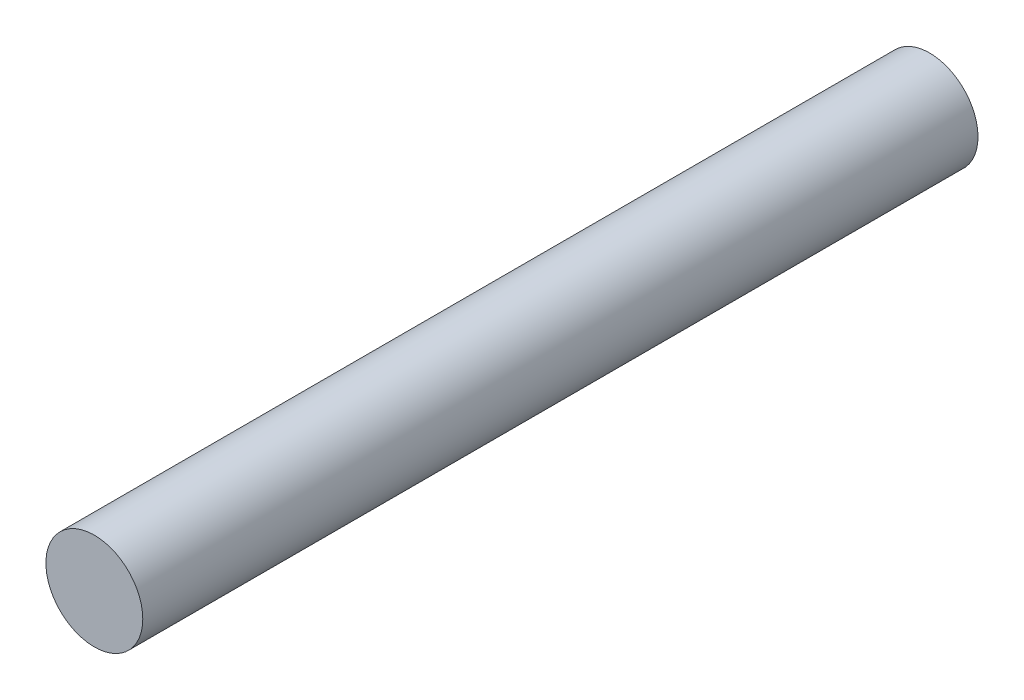
ISO-10303-21;
HEADER;
FILE_DESCRIPTION(('STEP AP214'),'2;1');
FILE_NAME('part.step','',(''),(''),'','','');
FILE_SCHEMA(('AUTOMOTIVE_DESIGN { 1 0 10303 214 1 1 1 1 }'));
ENDSEC;
DATA;
#1=APPLICATION_CONTEXT('core data for automotive mechanical design processes');
#2=APPLICATION_PROTOCOL_DEFINITION('international standard','automotive_design',2000,#1);
#3=PRODUCT_CONTEXT('',#1,'mechanical');
#4=PRODUCT('Part','Part','',(#3));
#5=PRODUCT_RELATED_PRODUCT_CATEGORY('part','',(#4));
#6=PRODUCT_DEFINITION_FORMATION('','',#4);
#7=PRODUCT_DEFINITION_CONTEXT('part definition',#1,'design');
#8=PRODUCT_DEFINITION('design','',#6,#7);
#9=PRODUCT_DEFINITION_SHAPE('','',#8);
#10=(LENGTH_UNIT() NAMED_UNIT(*) SI_UNIT(.MILLI.,.METRE.));
#11=(NAMED_UNIT(*) PLANE_ANGLE_UNIT() SI_UNIT($,.RADIAN.));
#12=(NAMED_UNIT(*) SI_UNIT($,.STERADIAN.) SOLID_ANGLE_UNIT());
#13=UNCERTAINTY_MEASURE_WITH_UNIT(LENGTH_MEASURE(1.E-05),#10,'distance_accuracy_value','');
#14=(GEOMETRIC_REPRESENTATION_CONTEXT(3) GLOBAL_UNCERTAINTY_ASSIGNED_CONTEXT((#13)) GLOBAL_UNIT_ASSIGNED_CONTEXT((#10,
#11,#12)) REPRESENTATION_CONTEXT('',''));
#15=CARTESIAN_POINT('',(0.,0.,0.));
#16=DIRECTION('',(0.,0.,1.));
#17=DIRECTION('',(1.,0.,0.));
#18=AXIS2_PLACEMENT_3D('',#15,#16,#17);
#19=CARTESIAN_POINT('',(-19.7286285002747,-1.85952857214033,185.));
#20=DIRECTION('',(0.,0.,-1.));
#21=DIRECTION('',(-1.,0.,0.));
#22=AXIS2_PLACEMENT_3D('',#19,#20,#21);
#23=CYLINDRICAL_SURFACE('',#22,10.7293812988966);
#24=CARTESIAN_POINT('',(-19.7286285002747,-1.85952857214033,185.));
#25=DIRECTION('',(0.,0.,1.));
#26=DIRECTION('',(1.,0.,0.));
#27=AXIS2_PLACEMENT_3D('',#24,#25,#26);
#28=CIRCLE('',#27,10.7293812988966);
#29=CARTESIAN_POINT('',(-8.99924720137805,-1.85952857214033,185.));
#30=VERTEX_POINT('',#29);
#31=EDGE_CURVE('E10',#30,#30,#28,.T.);
#32=ORIENTED_EDGE('',*,*,#31,.F.);
#33=EDGE_LOOP('',(#32));
#34=FACE_BOUND('',#33,.T.);
#35=CARTESIAN_POINT('',(-19.7286285002747,-1.85952857214033,0.));
#36=DIRECTION('',(0.,0.,1.));
#37=DIRECTION('',(1.,0.,0.));
#38=AXIS2_PLACEMENT_3D('',#35,#36,#37);
#39=CIRCLE('',#38,10.7293812988966);
#40=CARTESIAN_POINT('',(-8.99924720137805,-1.85952857214033,0.));
#41=VERTEX_POINT('',#40);
#42=EDGE_CURVE('E36',#41,#41,#39,.T.);
#43=ORIENTED_EDGE('',*,*,#42,.T.);
#44=EDGE_LOOP('',(#43));
#45=FACE_BOUND('',#44,.T.);
#46=ADVANCED_FACE('F33',(#34,#45),#23,.T.);
#47=CARTESIAN_POINT('',(-19.7286285002747,-1.85952857214033,185.));
#48=DIRECTION('',(0.,0.,1.));
#49=DIRECTION('',(1.,0.,0.));
#50=AXIS2_PLACEMENT_3D('',#47,#48,#49);
#51=PLANE('',#50);
#52=ORIENTED_EDGE('',*,*,#31,.T.);
#53=EDGE_LOOP('',(#52));
#54=FACE_BOUND('',#53,.T.);
#55=ADVANCED_FACE('F48',(#54),#51,.T.);
#56=CARTESIAN_POINT('',(-19.7286285002747,-1.85952857214033,0.));
#57=DIRECTION('',(0.,0.,1.));
#58=DIRECTION('',(1.,0.,0.));
#59=AXIS2_PLACEMENT_3D('',#56,#57,#58);
#60=PLANE('',#59);
#61=ORIENTED_EDGE('',*,*,#42,.F.);
#62=EDGE_LOOP('',(#61));
#63=FACE_BOUND('',#62,.T.);
#64=ADVANCED_FACE('F46',(#63),#60,.F.);
#65=CLOSED_SHELL('',(#46,#55,#64));
#66=MANIFOLD_SOLID_BREP('B2',#65);
#67=ADVANCED_BREP_SHAPE_REPRESENTATION('',(#18,#66),#14);
#68=SHAPE_DEFINITION_REPRESENTATION(#9,#67);
ENDSEC;
END-ISO-10303-21;
